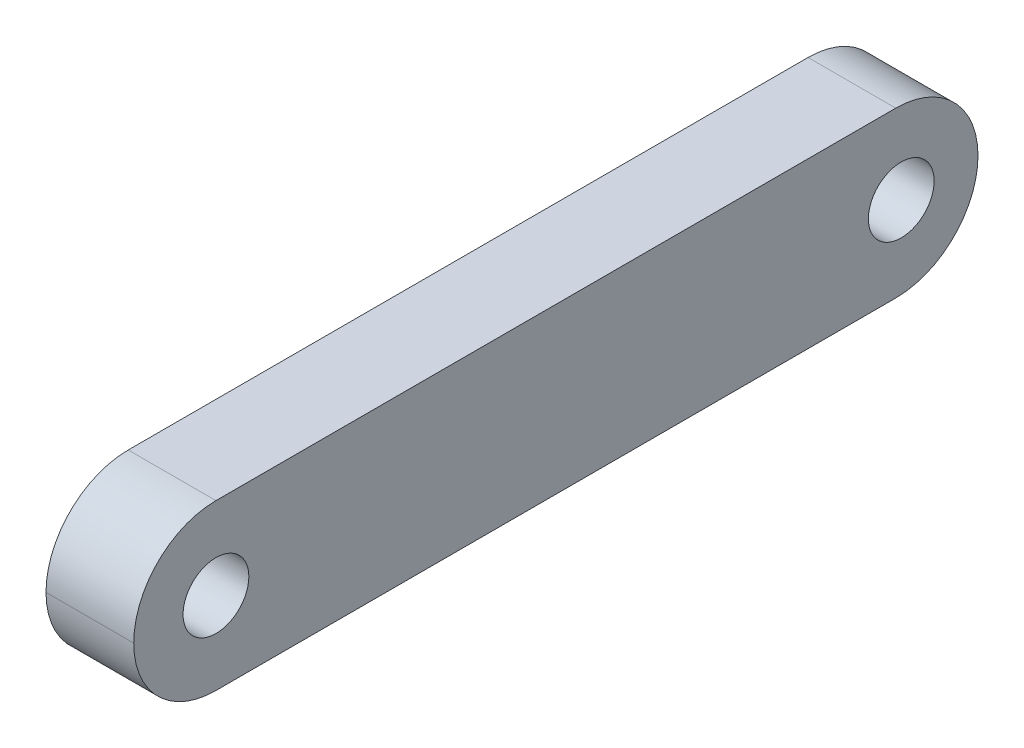
ISO-10303-21;
HEADER;
FILE_DESCRIPTION(('STEP AP214'),'2;1');
FILE_NAME('part.step','',(''),(''),'','','');
FILE_SCHEMA(('AUTOMOTIVE_DESIGN { 1 0 10303 214 1 1 1 1 }'));
ENDSEC;
DATA;
#1=APPLICATION_CONTEXT('core data for automotive mechanical design processes');
#2=APPLICATION_PROTOCOL_DEFINITION('international standard','automotive_design',2000,#1);
#3=PRODUCT_CONTEXT('',#1,'mechanical');
#4=PRODUCT('Part','Part','',(#3));
#5=PRODUCT_RELATED_PRODUCT_CATEGORY('part','',(#4));
#6=PRODUCT_DEFINITION_FORMATION('','',#4);
#7=PRODUCT_DEFINITION_CONTEXT('part definition',#1,'design');
#8=PRODUCT_DEFINITION('design','',#6,#7);
#9=PRODUCT_DEFINITION_SHAPE('','',#8);
#10=(LENGTH_UNIT() NAMED_UNIT(*) SI_UNIT(.MILLI.,.METRE.));
#11=(NAMED_UNIT(*) PLANE_ANGLE_UNIT() SI_UNIT($,.RADIAN.));
#12=(NAMED_UNIT(*) SI_UNIT($,.STERADIAN.) SOLID_ANGLE_UNIT());
#13=UNCERTAINTY_MEASURE_WITH_UNIT(LENGTH_MEASURE(1.E-05),#10,'distance_accuracy_value','');
#14=(GEOMETRIC_REPRESENTATION_CONTEXT(3) GLOBAL_UNCERTAINTY_ASSIGNED_CONTEXT((#13)) GLOBAL_UNIT_ASSIGNED_CONTEXT((#10,
#11,#12)) REPRESENTATION_CONTEXT('',''));
#15=CARTESIAN_POINT('',(0.,0.,0.));
#16=DIRECTION('',(0.,0.,1.));
#17=DIRECTION('',(1.,0.,0.));
#18=AXIS2_PLACEMENT_3D('',#15,#16,#17);
#19=CARTESIAN_POINT('',(1.6,0.,0.));
#20=DIRECTION('',(1.,0.,0.));
#21=DIRECTION('',(0.,0.,-1.));
#22=AXIS2_PLACEMENT_3D('',#19,#20,#21);
#23=PLANE('',#22);
#24=CARTESIAN_POINT('',(1.6,-1.5,-1.5));
#25=DIRECTION('',(1.,0.,0.));
#26=DIRECTION('',(0.,0.,-1.));
#27=AXIS2_PLACEMENT_3D('',#24,#25,#26);
#28=CIRCLE('',#27,0.6);
#29=CARTESIAN_POINT('',(1.6,-1.5,-2.1));
#30=VERTEX_POINT('',#29);
#31=EDGE_CURVE('E171',#30,#30,#28,.T.);
#32=ORIENTED_EDGE('',*,*,#31,.F.);
#33=EDGE_LOOP('',(#32));
#34=FACE_BOUND('',#33,.T.);
#35=DIRECTION('',(0.,0.,-1.));
#36=VECTOR('',#35,1.);
#37=CARTESIAN_POINT('',(1.6,-3.,0.));
#38=LINE('',#37,#36);
#39=CARTESIAN_POINT('',(1.6,-3.,-1.5));
#40=VERTEX_POINT('',#39);
#41=CARTESIAN_POINT('',(1.6,-3.,-13.9));
#42=VERTEX_POINT('',#41);
#43=EDGE_CURVE('E169',#40,#42,#38,.T.);
#44=ORIENTED_EDGE('',*,*,#43,.T.);
#45=CARTESIAN_POINT('',(1.6,-1.5,-13.9));
#46=DIRECTION('',(1.,0.,0.));
#47=DIRECTION('',(0.,0.,-1.));
#48=AXIS2_PLACEMENT_3D('',#45,#46,#47);
#49=CIRCLE('',#48,1.5);
#50=CARTESIAN_POINT('',(1.6,-1.5,-15.4));
#51=VERTEX_POINT('',#50);
#52=EDGE_CURVE('E153',#42,#51,#49,.T.);
#53=ORIENTED_EDGE('',*,*,#52,.T.);
#54=CARTESIAN_POINT('',(1.6,-1.5,-13.9));
#55=DIRECTION('',(1.,0.,0.));
#56=DIRECTION('',(0.,0.,-1.));
#57=AXIS2_PLACEMENT_3D('',#54,#55,#56);
#58=CIRCLE('',#57,1.5);
#59=CARTESIAN_POINT('',(1.6,0.,-13.9));
#60=VERTEX_POINT('',#59);
#61=EDGE_CURVE('E84',#51,#60,#58,.T.);
#62=ORIENTED_EDGE('',*,*,#61,.T.);
#63=DIRECTION('',(0.,0.,-1.));
#64=VECTOR('',#63,1.);
#65=CARTESIAN_POINT('',(1.6,0.,0.));
#66=LINE('',#65,#64);
#67=CARTESIAN_POINT('',(1.6,0.,-1.5));
#68=VERTEX_POINT('',#67);
#69=EDGE_CURVE('E138',#68,#60,#66,.T.);
#70=ORIENTED_EDGE('',*,*,#69,.F.);
#71=CARTESIAN_POINT('',(1.6,-1.5,-1.5));
#72=DIRECTION('',(1.,0.,0.));
#73=DIRECTION('',(0.,0.,-1.));
#74=AXIS2_PLACEMENT_3D('',#71,#72,#73);
#75=CIRCLE('',#74,1.5);
#76=CARTESIAN_POINT('',(1.6,-1.5,0.));
#77=VERTEX_POINT('',#76);
#78=EDGE_CURVE('E157',#68,#77,#75,.T.);
#79=ORIENTED_EDGE('',*,*,#78,.T.);
#80=CARTESIAN_POINT('',(1.6,-1.5,-1.5));
#81=DIRECTION('',(1.,0.,0.));
#82=DIRECTION('',(0.,0.,-1.));
#83=AXIS2_PLACEMENT_3D('',#80,#81,#82);
#84=CIRCLE('',#83,1.5);
#85=EDGE_CURVE('E141',#77,#40,#84,.T.);
#86=ORIENTED_EDGE('',*,*,#85,.T.);
#87=EDGE_LOOP('',(#44,#53,#62,#70,#79,#86));
#88=FACE_BOUND('',#87,.T.);
#89=CARTESIAN_POINT('',(1.6,-1.5,-14.));
#90=DIRECTION('',(1.,0.,0.));
#91=DIRECTION('',(0.,0.,-1.));
#92=AXIS2_PLACEMENT_3D('',#89,#90,#91);
#93=CIRCLE('',#92,0.6);
#94=CARTESIAN_POINT('',(1.6,-1.5,-14.6));
#95=VERTEX_POINT('',#94);
#96=EDGE_CURVE('E149',#95,#95,#93,.T.);
#97=ORIENTED_EDGE('',*,*,#96,.F.);
#98=EDGE_LOOP('',(#97));
#99=FACE_BOUND('',#98,.T.);
#100=ADVANCED_FACE('F67',(#34,#88,#99),#23,.T.);
#101=CARTESIAN_POINT('',(0.,0.,0.));
#102=DIRECTION('',(1.,0.,0.));
#103=DIRECTION('',(0.,0.,-1.));
#104=AXIS2_PLACEMENT_3D('',#101,#102,#103);
#105=PLANE('',#104);
#106=CARTESIAN_POINT('',(0.,-1.5,-13.9));
#107=DIRECTION('',(1.,0.,0.));
#108=DIRECTION('',(0.,0.,-1.));
#109=AXIS2_PLACEMENT_3D('',#106,#107,#108);
#110=CIRCLE('',#109,1.5);
#111=CARTESIAN_POINT('',(0.,0.,-13.9));
#112=VERTEX_POINT('',#111);
#113=CARTESIAN_POINT('',(0.,-1.5,-15.4));
#114=VERTEX_POINT('',#113);
#115=EDGE_CURVE('E132',#112,#114,#110,.F.);
#116=ORIENTED_EDGE('',*,*,#115,.T.);
#117=CARTESIAN_POINT('',(0.,-1.5,-13.9));
#118=DIRECTION('',(1.,0.,0.));
#119=DIRECTION('',(0.,0.,-1.));
#120=AXIS2_PLACEMENT_3D('',#117,#118,#119);
#121=CIRCLE('',#120,1.5);
#122=CARTESIAN_POINT('',(0.,-3.,-13.9));
#123=VERTEX_POINT('',#122);
#124=EDGE_CURVE('E164',#114,#123,#121,.F.);
#125=ORIENTED_EDGE('',*,*,#124,.T.);
#126=DIRECTION('',(0.,0.,-1.));
#127=VECTOR('',#126,1.);
#128=CARTESIAN_POINT('',(0.,-3.,0.));
#129=LINE('',#128,#127);
#130=CARTESIAN_POINT('',(0.,-3.,-1.5));
#131=VERTEX_POINT('',#130);
#132=EDGE_CURVE('E127',#131,#123,#129,.T.);
#133=ORIENTED_EDGE('',*,*,#132,.F.);
#134=CARTESIAN_POINT('',(0.,-1.5,-1.5));
#135=DIRECTION('',(1.,0.,0.));
#136=DIRECTION('',(0.,0.,-1.));
#137=AXIS2_PLACEMENT_3D('',#134,#135,#136);
#138=CIRCLE('',#137,1.5);
#139=CARTESIAN_POINT('',(0.,-1.5,0.));
#140=VERTEX_POINT('',#139);
#141=EDGE_CURVE('E120',#131,#140,#138,.F.);
#142=ORIENTED_EDGE('',*,*,#141,.T.);
#143=CARTESIAN_POINT('',(0.,-1.5,-1.5));
#144=DIRECTION('',(1.,0.,0.));
#145=DIRECTION('',(0.,0.,-1.));
#146=AXIS2_PLACEMENT_3D('',#143,#144,#145);
#147=CIRCLE('',#146,1.5);
#148=CARTESIAN_POINT('',(0.,0.,-1.5));
#149=VERTEX_POINT('',#148);
#150=EDGE_CURVE('E125',#140,#149,#147,.F.);
#151=ORIENTED_EDGE('',*,*,#150,.T.);
#152=DIRECTION('',(0.,0.,-1.));
#153=VECTOR('',#152,1.);
#154=CARTESIAN_POINT('',(0.,0.,0.));
#155=LINE('',#154,#153);
#156=EDGE_CURVE('E167',#149,#112,#155,.T.);
#157=ORIENTED_EDGE('',*,*,#156,.T.);
#158=EDGE_LOOP('',(#116,#125,#133,#142,#151,#157));
#159=FACE_BOUND('',#158,.T.);
#160=CARTESIAN_POINT('',(0.,-1.5,-1.5));
#161=DIRECTION('',(1.,0.,0.));
#162=DIRECTION('',(0.,0.,-1.));
#163=AXIS2_PLACEMENT_3D('',#160,#161,#162);
#164=CIRCLE('',#163,0.6);
#165=CARTESIAN_POINT('',(0.,-1.5,-2.1));
#166=VERTEX_POINT('',#165);
#167=EDGE_CURVE('E175',#166,#166,#164,.T.);
#168=ORIENTED_EDGE('',*,*,#167,.T.);
#169=EDGE_LOOP('',(#168));
#170=FACE_BOUND('',#169,.T.);
#171=CARTESIAN_POINT('',(0.,-1.5,-14.));
#172=DIRECTION('',(1.,0.,0.));
#173=DIRECTION('',(0.,0.,-1.));
#174=AXIS2_PLACEMENT_3D('',#171,#172,#173);
#175=CIRCLE('',#174,0.6);
#176=CARTESIAN_POINT('',(0.,-1.5,-14.6));
#177=VERTEX_POINT('',#176);
#178=EDGE_CURVE('E144',#177,#177,#175,.T.);
#179=ORIENTED_EDGE('',*,*,#178,.T.);
#180=EDGE_LOOP('',(#179));
#181=FACE_BOUND('',#180,.T.);
#182=ADVANCED_FACE('F122',(#159,#170,#181),#105,.F.);
#183=CARTESIAN_POINT('',(1.6,-3.,0.));
#184=DIRECTION('',(0.,1.,0.));
#185=DIRECTION('',(0.,0.,1.));
#186=AXIS2_PLACEMENT_3D('',#183,#184,#185);
#187=PLANE('',#186);
#188=ORIENTED_EDGE('',*,*,#132,.T.);
#189=DIRECTION('',(-1.,0.,0.));
#190=VECTOR('',#189,1.);
#191=CARTESIAN_POINT('',(1.6,-3.,-13.9));
#192=LINE('',#191,#190);
#193=EDGE_CURVE('E159',#123,#42,#192,.F.);
#194=ORIENTED_EDGE('',*,*,#193,.T.);
#195=ORIENTED_EDGE('',*,*,#43,.F.);
#196=DIRECTION('',(-1.,0.,0.));
#197=VECTOR('',#196,1.);
#198=CARTESIAN_POINT('',(1.6,-3.,-1.5));
#199=LINE('',#198,#197);
#200=EDGE_CURVE('E162',#40,#131,#199,.T.);
#201=ORIENTED_EDGE('',*,*,#200,.T.);
#202=EDGE_LOOP('',(#188,#194,#195,#201));
#203=FACE_BOUND('',#202,.T.);
#204=ADVANCED_FACE('F192',(#203),#187,.F.);
#205=CARTESIAN_POINT('',(1.6,0.,0.));
#206=DIRECTION('',(0.,1.,0.));
#207=DIRECTION('',(0.,0.,1.));
#208=AXIS2_PLACEMENT_3D('',#205,#206,#207);
#209=PLANE('',#208);
#210=ORIENTED_EDGE('',*,*,#69,.T.);
#211=DIRECTION('',(-1.,0.,0.));
#212=VECTOR('',#211,1.);
#213=CARTESIAN_POINT('',(1.6,0.,-13.9));
#214=LINE('',#213,#212);
#215=EDGE_CURVE('E12',#60,#112,#214,.T.);
#216=ORIENTED_EDGE('',*,*,#215,.T.);
#217=ORIENTED_EDGE('',*,*,#156,.F.);
#218=DIRECTION('',(-1.,0.,0.));
#219=VECTOR('',#218,1.);
#220=CARTESIAN_POINT('',(1.6,0.,-1.5));
#221=LINE('',#220,#219);
#222=EDGE_CURVE('E76',#149,#68,#221,.F.);
#223=ORIENTED_EDGE('',*,*,#222,.T.);
#224=EDGE_LOOP('',(#210,#216,#217,#223));
#225=FACE_BOUND('',#224,.T.);
#226=ADVANCED_FACE('F199',(#225),#209,.T.);
#227=CARTESIAN_POINT('',(1.6,-1.5,-1.5));
#228=DIRECTION('',(-1.,0.,0.));
#229=DIRECTION('',(0.,0.,1.));
#230=AXIS2_PLACEMENT_3D('',#227,#228,#229);
#231=CYLINDRICAL_SURFACE('',#230,0.6);
#232=ORIENTED_EDGE('',*,*,#31,.T.);
#233=EDGE_LOOP('',(#232));
#234=FACE_BOUND('',#233,.T.);
#235=ORIENTED_EDGE('',*,*,#167,.F.);
#236=EDGE_LOOP('',(#235));
#237=FACE_BOUND('',#236,.T.);
#238=ADVANCED_FACE('F196',(#234,#237),#231,.F.);
#239=CARTESIAN_POINT('',(1.6,-1.5,-14.));
#240=DIRECTION('',(-1.,0.,0.));
#241=DIRECTION('',(0.,0.,1.));
#242=AXIS2_PLACEMENT_3D('',#239,#240,#241);
#243=CYLINDRICAL_SURFACE('',#242,0.6);
#244=ORIENTED_EDGE('',*,*,#96,.T.);
#245=EDGE_LOOP('',(#244));
#246=FACE_BOUND('',#245,.T.);
#247=ORIENTED_EDGE('',*,*,#178,.F.);
#248=EDGE_LOOP('',(#247));
#249=FACE_BOUND('',#248,.T.);
#250=ADVANCED_FACE('F183',(#246,#249),#243,.F.);
#251=CARTESIAN_POINT('',(1.6,-1.5,-13.9));
#252=DIRECTION('',(-1.,0.,0.));
#253=DIRECTION('',(0.,0.,1.));
#254=AXIS2_PLACEMENT_3D('',#251,#252,#253);
#255=CYLINDRICAL_SURFACE('',#254,1.5);
#256=ORIENTED_EDGE('',*,*,#215,.F.);
#257=ORIENTED_EDGE('',*,*,#61,.F.);
#258=DIRECTION('',(-1.,0.,0.));
#259=VECTOR('',#258,1.);
#260=CARTESIAN_POINT('',(1.6,-1.5,-15.4));
#261=LINE('',#260,#259);
#262=EDGE_CURVE('E142',#114,#51,#261,.F.);
#263=ORIENTED_EDGE('',*,*,#262,.F.);
#264=ORIENTED_EDGE('',*,*,#115,.F.);
#265=EDGE_LOOP('',(#256,#257,#263,#264));
#266=FACE_BOUND('',#265,.T.);
#267=ADVANCED_FACE('F208',(#266),#255,.T.);
#268=CARTESIAN_POINT('',(1.6,-1.5,-13.9));
#269=DIRECTION('',(1.,0.,0.));
#270=DIRECTION('',(0.,0.,-1.));
#271=AXIS2_PLACEMENT_3D('',#268,#269,#270);
#272=CYLINDRICAL_SURFACE('',#271,1.5);
#273=ORIENTED_EDGE('',*,*,#52,.F.);
#274=ORIENTED_EDGE('',*,*,#193,.F.);
#275=ORIENTED_EDGE('',*,*,#124,.F.);
#276=ORIENTED_EDGE('',*,*,#262,.T.);
#277=EDGE_LOOP('',(#273,#274,#275,#276));
#278=FACE_BOUND('',#277,.T.);
#279=ADVANCED_FACE('F205',(#278),#272,.T.);
#280=CARTESIAN_POINT('',(1.6,-1.5,-1.5));
#281=DIRECTION('',(1.,0.,0.));
#282=DIRECTION('',(0.,0.,-1.));
#283=AXIS2_PLACEMENT_3D('',#280,#281,#282);
#284=CYLINDRICAL_SURFACE('',#283,1.5);
#285=DIRECTION('',(-1.,0.,0.));
#286=VECTOR('',#285,1.);
#287=CARTESIAN_POINT('',(0.,-1.5,0.));
#288=LINE('',#287,#286);
#289=EDGE_CURVE('E71',#77,#140,#288,.T.);
#290=ORIENTED_EDGE('',*,*,#289,.F.);
#291=ORIENTED_EDGE('',*,*,#78,.F.);
#292=ORIENTED_EDGE('',*,*,#222,.F.);
#293=ORIENTED_EDGE('',*,*,#150,.F.);
#294=EDGE_LOOP('',(#290,#291,#292,#293));
#295=FACE_BOUND('',#294,.T.);
#296=ADVANCED_FACE('F69',(#295),#284,.T.);
#297=CARTESIAN_POINT('',(1.6,-1.5,-1.5));
#298=DIRECTION('',(-1.,0.,0.));
#299=DIRECTION('',(0.,0.,1.));
#300=AXIS2_PLACEMENT_3D('',#297,#298,#299);
#301=CYLINDRICAL_SURFACE('',#300,1.5);
#302=ORIENTED_EDGE('',*,*,#85,.F.);
#303=ORIENTED_EDGE('',*,*,#289,.T.);
#304=ORIENTED_EDGE('',*,*,#141,.F.);
#305=ORIENTED_EDGE('',*,*,#200,.F.);
#306=EDGE_LOOP('',(#302,#303,#304,#305));
#307=FACE_BOUND('',#306,.T.);
#308=ADVANCED_FACE('F140',(#307),#301,.T.);
#309=CLOSED_SHELL('',(#100,#182,#204,#226,#238,#250,#267,#279,#296,#308));
#310=MANIFOLD_SOLID_BREP('B2',#309);
#311=ADVANCED_BREP_SHAPE_REPRESENTATION('',(#18,#310),#14);
#312=SHAPE_DEFINITION_REPRESENTATION(#9,#311);
ENDSEC;
END-ISO-10303-21;
